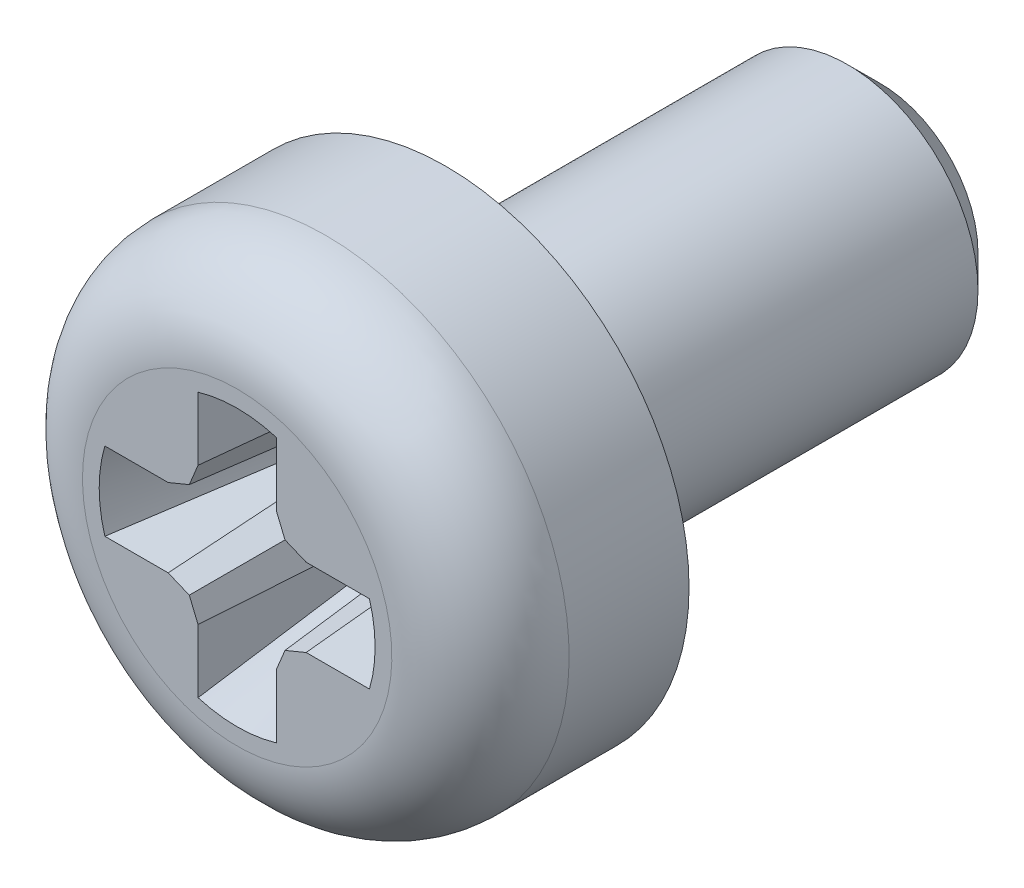
ISO-10303-21;
HEADER;
FILE_DESCRIPTION(('STEP AP214'),'2;1');
FILE_NAME('part.step','',(''),(''),'','','');
FILE_SCHEMA(('AUTOMOTIVE_DESIGN { 1 0 10303 214 1 1 1 1 }'));
ENDSEC;
DATA;
#1=APPLICATION_CONTEXT('core data for automotive mechanical design processes');
#2=APPLICATION_PROTOCOL_DEFINITION('international standard','automotive_design',2000,#1);
#3=PRODUCT_CONTEXT('',#1,'mechanical');
#4=PRODUCT('Part','Part','',(#3));
#5=PRODUCT_RELATED_PRODUCT_CATEGORY('part','',(#4));
#6=PRODUCT_DEFINITION_FORMATION('','',#4);
#7=PRODUCT_DEFINITION_CONTEXT('part definition',#1,'design');
#8=PRODUCT_DEFINITION('design','',#6,#7);
#9=PRODUCT_DEFINITION_SHAPE('','',#8);
#10=(LENGTH_UNIT() NAMED_UNIT(*) SI_UNIT(.MILLI.,.METRE.));
#11=(NAMED_UNIT(*) PLANE_ANGLE_UNIT() SI_UNIT($,.RADIAN.));
#12=(NAMED_UNIT(*) SI_UNIT($,.STERADIAN.) SOLID_ANGLE_UNIT());
#13=UNCERTAINTY_MEASURE_WITH_UNIT(LENGTH_MEASURE(1.E-05),#10,'distance_accuracy_value','');
#14=(GEOMETRIC_REPRESENTATION_CONTEXT(3) GLOBAL_UNCERTAINTY_ASSIGNED_CONTEXT((#13)) GLOBAL_UNIT_ASSIGNED_CONTEXT((#10,
#11,#12)) REPRESENTATION_CONTEXT('',''));
#15=CARTESIAN_POINT('',(0.,0.,0.));
#16=DIRECTION('',(0.,0.,1.));
#17=DIRECTION('',(1.,0.,0.));
#18=AXIS2_PLACEMENT_3D('',#15,#16,#17);
#19=CARTESIAN_POINT('',(0.,0.,0.));
#20=DIRECTION('',(0.,0.,1.));
#21=DIRECTION('',(1.,0.,0.));
#22=AXIS2_PLACEMENT_3D('',#19,#20,#21);
#23=PLANE('',#22);
#24=CARTESIAN_POINT('',(0.,0.,0.));
#25=DIRECTION('',(0.,0.,1.));
#26=DIRECTION('',(1.,0.,0.));
#27=AXIS2_PLACEMENT_3D('',#24,#25,#26);
#28=CIRCLE('',#27,2.8);
#29=CARTESIAN_POINT('',(2.8,0.,0.));
#30=VERTEX_POINT('',#29);
#31=EDGE_CURVE('E59',#30,#30,#28,.T.);
#32=ORIENTED_EDGE('',*,*,#31,.F.);
#33=EDGE_LOOP('',(#32));
#34=FACE_BOUND('',#33,.T.);
#35=CARTESIAN_POINT('',(0.,0.,0.));
#36=DIRECTION('',(0.,0.,1.));
#37=DIRECTION('',(1.,0.,0.));
#38=AXIS2_PLACEMENT_3D('',#35,#36,#37);
#39=CIRCLE('',#38,1.5);
#40=CARTESIAN_POINT('',(1.5,0.,0.));
#41=VERTEX_POINT('',#40);
#42=EDGE_CURVE('E11',#41,#41,#39,.F.);
#43=ORIENTED_EDGE('',*,*,#42,.F.);
#44=EDGE_LOOP('',(#43));
#45=FACE_BOUND('',#44,.T.);
#46=ADVANCED_FACE('F43',(#34,#45),#23,.F.);
#47=CARTESIAN_POINT('',(0.,0.,2.4));
#48=DIRECTION('',(0.,0.,-1.));
#49=DIRECTION('',(-1.,0.,0.));
#50=AXIS2_PLACEMENT_3D('',#47,#48,#49);
#51=CYLINDRICAL_SURFACE('',#50,2.8);
#52=CARTESIAN_POINT('',(0.,0.,1.38));
#53=DIRECTION('',(0.,0.,-1.));
#54=DIRECTION('',(0.,1.,0.));
#55=AXIS2_PLACEMENT_3D('',#52,#53,#54);
#56=CIRCLE('',#55,2.8);
#57=CARTESIAN_POINT('',(0.,2.8,1.38));
#58=VERTEX_POINT('',#57);
#59=EDGE_CURVE('E434',#58,#58,#56,.T.);
#60=ORIENTED_EDGE('',*,*,#59,.T.);
#61=EDGE_LOOP('',(#60));
#62=FACE_BOUND('',#61,.T.);
#63=ORIENTED_EDGE('',*,*,#31,.T.);
#64=EDGE_LOOP('',(#63));
#65=FACE_BOUND('',#64,.T.);
#66=ADVANCED_FACE('F369',(#62,#65),#51,.T.);
#67=CARTESIAN_POINT('',(0.,0.,1.38));
#68=DIRECTION('',(0.,0.,-1.));
#69=DIRECTION('',(0.,1.,0.));
#70=AXIS2_PLACEMENT_3D('',#67,#68,#69);
#71=TOROIDAL_SURFACE('',#70,1.78,1.02);
#72=ORIENTED_EDGE('',*,*,#59,.F.);
#73=EDGE_LOOP('',(#72));
#74=FACE_BOUND('',#73,.T.);
#75=CARTESIAN_POINT('',(0.,0.,2.4));
#76=DIRECTION('',(0.,0.,-1.));
#77=DIRECTION('',(0.,1.,0.));
#78=AXIS2_PLACEMENT_3D('',#75,#76,#77);
#79=CIRCLE('',#78,1.78);
#80=CARTESIAN_POINT('',(0.,1.78,2.4));
#81=VERTEX_POINT('',#80);
#82=EDGE_CURVE('E431',#81,#81,#79,.T.);
#83=ORIENTED_EDGE('',*,*,#82,.T.);
#84=EDGE_LOOP('',(#83));
#85=FACE_BOUND('',#84,.T.);
#86=ADVANCED_FACE('F377',(#74,#85),#71,.T.);
#87=CARTESIAN_POINT('',(0.,0.,2.4));
#88=DIRECTION('',(0.,0.,1.));
#89=DIRECTION('',(1.,0.,0.));
#90=AXIS2_PLACEMENT_3D('',#87,#88,#89);
#91=PLANE('',#90);
#92=DIRECTION('',(0.,-1.,0.));
#93=VECTOR('',#92,1.);
#94=CARTESIAN_POINT('',(-0.450000000000004,0.793749999999997,2.4));
#95=LINE('',#94,#93);
#96=CARTESIAN_POINT('',(-0.450000000000006,1.52238505313209,2.4));
#97=VERTEX_POINT('',#96);
#98=CARTESIAN_POINT('',(-0.450000000000004,0.793749999999997,2.4));
#99=VERTEX_POINT('',#98);
#100=EDGE_CURVE('E330',#97,#99,#95,.T.);
#101=ORIENTED_EDGE('',*,*,#100,.F.);
#102=CARTESIAN_POINT('',(0.,0.,2.4));
#103=DIRECTION('',(0.,0.,1.));
#104=DIRECTION('',(1.,0.,0.));
#105=AXIS2_PLACEMENT_3D('',#102,#103,#104);
#106=CIRCLE('',#105,1.5875);
#107=CARTESIAN_POINT('',(0.45,1.52238505313209,2.4));
#108=VERTEX_POINT('',#107);
#109=EDGE_CURVE('E335',#108,#97,#106,.T.);
#110=ORIENTED_EDGE('',*,*,#109,.F.);
#111=DIRECTION('',(0.,1.,0.));
#112=VECTOR('',#111,1.);
#113=CARTESIAN_POINT('',(0.45,1.52238505313209,2.4));
#114=LINE('',#113,#112);
#115=CARTESIAN_POINT('',(0.45,0.793749999999999,2.4));
#116=VERTEX_POINT('',#115);
#117=EDGE_CURVE('E423',#116,#108,#114,.T.);
#118=ORIENTED_EDGE('',*,*,#117,.F.);
#119=DIRECTION('',(-0.382683432365083,0.923879532511289,0.));
#120=VECTOR('',#119,1.);
#121=CARTESIAN_POINT('',(0.45,0.793749999999999,2.4));
#122=LINE('',#121,#120);
#123=CARTESIAN_POINT('',(0.550682043967123,0.550682043967123,2.4));
#124=VERTEX_POINT('',#123);
#125=EDGE_CURVE('E418',#124,#116,#122,.T.);
#126=ORIENTED_EDGE('',*,*,#125,.F.);
#127=DIRECTION('',(-0.92387953251129,0.382683432365083,0.));
#128=VECTOR('',#127,1.);
#129=CARTESIAN_POINT('',(0.793749999999998,0.450000000000001,2.4));
#130=LINE('',#129,#128);
#131=CARTESIAN_POINT('',(0.793749999999998,0.450000000000001,2.4));
#132=VERTEX_POINT('',#131);
#133=EDGE_CURVE('E196',#132,#124,#130,.T.);
#134=ORIENTED_EDGE('',*,*,#133,.F.);
#135=DIRECTION('',(-1.,0.,0.));
#136=VECTOR('',#135,1.);
#137=CARTESIAN_POINT('',(0.793749999999998,0.450000000000001,2.4));
#138=LINE('',#137,#136);
#139=CARTESIAN_POINT('',(1.52238505313209,0.450000000000001,2.4));
#140=VERTEX_POINT('',#139);
#141=EDGE_CURVE('E412',#140,#132,#138,.T.);
#142=ORIENTED_EDGE('',*,*,#141,.F.);
#143=CARTESIAN_POINT('',(0.,0.,2.4));
#144=DIRECTION('',(0.,0.,1.));
#145=DIRECTION('',(1.,0.,0.));
#146=AXIS2_PLACEMENT_3D('',#143,#144,#145);
#147=CIRCLE('',#146,1.5875);
#148=CARTESIAN_POINT('',(1.5223850531321,-0.449999999999984,2.4));
#149=VERTEX_POINT('',#148);
#150=EDGE_CURVE('E285',#149,#140,#147,.T.);
#151=ORIENTED_EDGE('',*,*,#150,.F.);
#152=DIRECTION('',(1.,0.,0.));
#153=VECTOR('',#152,1.);
#154=CARTESIAN_POINT('',(1.5223850531321,-0.449999999999984,2.4));
#155=LINE('',#154,#153);
#156=CARTESIAN_POINT('',(0.793750000000004,-0.449999999999992,2.4));
#157=VERTEX_POINT('',#156);
#158=EDGE_CURVE('E479',#157,#149,#155,.T.);
#159=ORIENTED_EDGE('',*,*,#158,.F.);
#160=DIRECTION('',(0.923879532511285,0.382683432365093,0.));
#161=VECTOR('',#160,1.);
#162=CARTESIAN_POINT('',(0.793750000000004,-0.449999999999992,2.4));
#163=LINE('',#162,#161);
#164=CARTESIAN_POINT('',(0.550682043967129,-0.550682043967117,2.4));
#165=VERTEX_POINT('',#164);
#166=EDGE_CURVE('E481',#165,#157,#163,.T.);
#167=ORIENTED_EDGE('',*,*,#166,.F.);
#168=DIRECTION('',(0.382683432365073,0.923879532511294,0.));
#169=VECTOR('',#168,1.);
#170=CARTESIAN_POINT('',(0.450000000000009,-0.793749999999994,2.4));
#171=LINE('',#170,#169);
#172=CARTESIAN_POINT('',(0.450000000000009,-0.793749999999994,2.4));
#173=VERTEX_POINT('',#172);
#174=EDGE_CURVE('E483',#173,#165,#171,.T.);
#175=ORIENTED_EDGE('',*,*,#174,.F.);
#176=DIRECTION('',(0.,1.,0.));
#177=VECTOR('',#176,1.);
#178=CARTESIAN_POINT('',(0.450000000000009,-0.793749999999994,2.4));
#179=LINE('',#178,#177);
#180=CARTESIAN_POINT('',(0.450000000000017,-1.52238505313209,2.4));
#181=VERTEX_POINT('',#180);
#182=EDGE_CURVE('E485',#181,#173,#179,.T.);
#183=ORIENTED_EDGE('',*,*,#182,.F.);
#184=CARTESIAN_POINT('',(0.,0.,2.4));
#185=DIRECTION('',(0.,0.,1.));
#186=DIRECTION('',(-1.,0.,0.));
#187=AXIS2_PLACEMENT_3D('',#184,#185,#186);
#188=CIRCLE('',#187,1.5875);
#189=CARTESIAN_POINT('',(-0.44999999999999,-1.52238505313209,2.4));
#190=VERTEX_POINT('',#189);
#191=EDGE_CURVE('E464',#190,#181,#188,.T.);
#192=ORIENTED_EDGE('',*,*,#191,.F.);
#193=DIRECTION('',(0.,-1.,0.));
#194=VECTOR('',#193,1.);
#195=CARTESIAN_POINT('',(-0.44999999999999,-1.52238505313209,2.4));
#196=LINE('',#195,#194);
#197=CARTESIAN_POINT('',(-0.449999999999995,-0.793750000000002,2.4));
#198=VERTEX_POINT('',#197);
#199=EDGE_CURVE('E467',#198,#190,#196,.T.);
#200=ORIENTED_EDGE('',*,*,#199,.F.);
#201=DIRECTION('',(0.38268343236509,-0.923879532511287,0.));
#202=VECTOR('',#201,1.);
#203=CARTESIAN_POINT('',(-0.449999999999995,-0.793750000000002,2.4));
#204=LINE('',#203,#202);
#205=CARTESIAN_POINT('',(-0.550682043967119,-0.550682043967127,2.4));
#206=VERTEX_POINT('',#205);
#207=EDGE_CURVE('E470',#206,#198,#204,.T.);
#208=ORIENTED_EDGE('',*,*,#207,.F.);
#209=DIRECTION('',(0.923879532511292,-0.382683432365077,0.));
#210=VECTOR('',#209,1.);
#211=CARTESIAN_POINT('',(-0.793749999999995,-0.450000000000007,2.4));
#212=LINE('',#211,#210);
#213=CARTESIAN_POINT('',(-0.793749999999995,-0.450000000000007,2.4));
#214=VERTEX_POINT('',#213);
#215=EDGE_CURVE('E473',#214,#206,#212,.T.);
#216=ORIENTED_EDGE('',*,*,#215,.F.);
#217=DIRECTION('',(1.,0.,0.));
#218=VECTOR('',#217,1.);
#219=CARTESIAN_POINT('',(-0.793749999999995,-0.450000000000007,2.4));
#220=LINE('',#219,#218);
#221=CARTESIAN_POINT('',(-1.52238505313209,-0.450000000000012,2.4));
#222=VERTEX_POINT('',#221);
#223=EDGE_CURVE('E476',#222,#214,#220,.T.);
#224=ORIENTED_EDGE('',*,*,#223,.F.);
#225=CARTESIAN_POINT('',(0.,0.,2.4));
#226=DIRECTION('',(0.,0.,1.));
#227=DIRECTION('',(0.,1.,0.));
#228=AXIS2_PLACEMENT_3D('',#225,#226,#227);
#229=CIRCLE('',#228,1.5875);
#230=CARTESIAN_POINT('',(-1.52238505313209,0.449999999999995,2.4));
#231=VERTEX_POINT('',#230);
#232=EDGE_CURVE('E141',#231,#222,#229,.T.);
#233=ORIENTED_EDGE('',*,*,#232,.F.);
#234=DIRECTION('',(-1.,0.,0.));
#235=VECTOR('',#234,1.);
#236=CARTESIAN_POINT('',(-1.52238505313209,0.449999999999995,2.4));
#237=LINE('',#236,#235);
#238=CARTESIAN_POINT('',(-0.79375,0.449999999999998,2.4));
#239=VERTEX_POINT('',#238);
#240=EDGE_CURVE('E453',#239,#231,#237,.T.);
#241=ORIENTED_EDGE('',*,*,#240,.F.);
#242=DIRECTION('',(-0.923879532511288,-0.382683432365087,0.));
#243=VECTOR('',#242,1.);
#244=CARTESIAN_POINT('',(-0.79375,0.449999999999998,2.4));
#245=LINE('',#244,#243);
#246=CARTESIAN_POINT('',(-0.550682043967125,0.550682043967121,2.4));
#247=VERTEX_POINT('',#246);
#248=EDGE_CURVE('E455',#247,#239,#245,.T.);
#249=ORIENTED_EDGE('',*,*,#248,.F.);
#250=DIRECTION('',(-0.38268343236508,-0.923879532511291,0.));
#251=VECTOR('',#250,1.);
#252=CARTESIAN_POINT('',(-0.450000000000004,0.793749999999997,2.4));
#253=LINE('',#252,#251);
#254=EDGE_CURVE('E460',#99,#247,#253,.T.);
#255=ORIENTED_EDGE('',*,*,#254,.F.);
#256=EDGE_LOOP('',(#101,#110,#118,#126,#134,#142,#151,#159,#167,#175,#183,#192,#200,#208,#216,
#224,#233,#241,#249,#255));
#257=FACE_BOUND('',#256,.T.);
#258=ORIENTED_EDGE('',*,*,#82,.F.);
#259=EDGE_LOOP('',(#258));
#260=FACE_BOUND('',#259,.T.);
#261=ADVANCED_FACE('F382',(#257,#260),#91,.T.);
#262=CARTESIAN_POINT('',(0.,0.,-5.));
#263=DIRECTION('',(0.,0.,1.));
#264=DIRECTION('',(1.,0.,0.));
#265=AXIS2_PLACEMENT_3D('',#262,#263,#264);
#266=PLANE('',#265);
#267=CARTESIAN_POINT('',(0.,0.,-5.));
#268=DIRECTION('',(0.,0.,1.));
#269=DIRECTION('',(1.,0.,0.));
#270=AXIS2_PLACEMENT_3D('',#267,#268,#269);
#271=CIRCLE('',#270,1.125);
#272=CARTESIAN_POINT('',(1.125,0.,-5.));
#273=VERTEX_POINT('',#272);
#274=EDGE_CURVE('E428',#273,#273,#271,.F.);
#275=ORIENTED_EDGE('',*,*,#274,.T.);
#276=EDGE_LOOP('',(#275));
#277=FACE_BOUND('',#276,.T.);
#278=ADVANCED_FACE('F385',(#277),#266,.F.);
#279=CARTESIAN_POINT('',(0.,0.,0.));
#280=DIRECTION('',(0.,0.,1.));
#281=DIRECTION('',(1.,0.,0.));
#282=AXIS2_PLACEMENT_3D('',#279,#280,#281);
#283=CYLINDRICAL_SURFACE('',#282,1.5);
#284=CARTESIAN_POINT('',(0.,0.,-4.625));
#285=DIRECTION('',(0.,0.,1.));
#286=DIRECTION('',(1.,0.,0.));
#287=AXIS2_PLACEMENT_3D('',#284,#285,#286);
#288=CIRCLE('',#287,1.5);
#289=CARTESIAN_POINT('',(1.5,0.,-4.625));
#290=VERTEX_POINT('',#289);
#291=EDGE_CURVE('E226',#290,#290,#288,.T.);
#292=ORIENTED_EDGE('',*,*,#291,.T.);
#293=EDGE_LOOP('',(#292));
#294=FACE_BOUND('',#293,.T.);
#295=ORIENTED_EDGE('',*,*,#42,.T.);
#296=EDGE_LOOP('',(#295));
#297=FACE_BOUND('',#296,.T.);
#298=ADVANCED_FACE('F391',(#294,#297),#283,.T.);
#299=CARTESIAN_POINT('',(0.,0.,-4.625));
#300=DIRECTION('',(0.,0.,1.));
#301=DIRECTION('',(1.,0.,0.));
#302=AXIS2_PLACEMENT_3D('',#299,#300,#301);
#303=CONICAL_SURFACE('',#302,1.5,0.785398163397451);
#304=ORIENTED_EDGE('',*,*,#274,.F.);
#305=EDGE_LOOP('',(#304));
#306=FACE_BOUND('',#305,.T.);
#307=ORIENTED_EDGE('',*,*,#291,.F.);
#308=EDGE_LOOP('',(#307));
#309=FACE_BOUND('',#308,.T.);
#310=ADVANCED_FACE('F235',(#306,#309),#303,.T.);
#311=CARTESIAN_POINT('',(0.,0.,2.4));
#312=DIRECTION('',(0.,0.,1.));
#313=DIRECTION('',(1.,0.,0.));
#314=AXIS2_PLACEMENT_3D('',#311,#312,#313);
#315=CONICAL_SURFACE('',#314,1.5875,0.26179938779915);
#316=ORIENTED_EDGE('',*,*,#109,.T.);
#317=CARTESIAN_POINT('',(-0.450000000000006,1.52238505313209,2.4));
#318=CARTESIAN_POINT('',(-0.414477744167481,1.41945884722323,1.99397875792218));
#319=CARTESIAN_POINT('',(-0.378956515806402,1.31648600397113,1.58796925989672));
#320=CARTESIAN_POINT('',(-0.30791611378637,1.11044704208215,0.775973749198562));
#321=CARTESIAN_POINT('',(-0.27239694012743,1.00738092344464,0.36998773652602));
#322=CARTESIAN_POINT('',(-0.23687879393995,0.904268167463262,-0.0359865320939932));
#323=B_SPLINE_CURVE_WITH_KNOTS('',3,(#317,#318,#319,#320,#321,#322),.UNSPECIFIED.,.F.,.F.,(4,2,
4),(0.,1.26110264823577,2.52220530501969),.UNSPECIFIED.);
#324=CARTESIAN_POINT('',(-0.271523126407119,1.00484524148506,0.36));
#325=VERTEX_POINT('',#324);
#326=EDGE_CURVE('E244',#325,#97,#323,.F.);
#327=ORIENTED_EDGE('',*,*,#326,.F.);
#328=CARTESIAN_POINT('',(0.,0.,0.36));
#329=DIRECTION('',(0.,0.,1.));
#330=DIRECTION('',(1.,0.,0.));
#331=AXIS2_PLACEMENT_3D('',#328,#329,#330);
#332=CIRCLE('',#331,1.04088364744051);
#333=CARTESIAN_POINT('',(0.271523126407115,1.00484524148506,0.36));
#334=VERTEX_POINT('',#333);
#335=EDGE_CURVE('E218',#334,#325,#332,.T.);
#336=ORIENTED_EDGE('',*,*,#335,.F.);
#337=CARTESIAN_POINT('',(0.271523126407115,1.00484524148506,0.36));
#338=CARTESIAN_POINT('',(0.318101305021576,1.13999510788411,0.892391017730642));
#339=CARTESIAN_POINT('',(0.364680851628295,1.27508285783648,1.42479767168435));
#340=CARTESIAN_POINT('',(0.424174405695201,1.44753878525971,2.10481210634625));
#341=CARTESIAN_POINT('',(0.43708715028611,1.48496430585635,2.25240545239254));
#342=CARTESIAN_POINT('',(0.45,1.52238505313209,2.4));
#343=B_SPLINE_CURVE_WITH_KNOTS('',3,(#337,#338,#339,#340,#341,#342),.UNSPECIFIED.,.F.,.F.,(4,2,
4),(0.,1.65374629121617,2.11217931713975),.UNSPECIFIED.);
#344=EDGE_CURVE('E68',#334,#108,#343,.T.);
#345=ORIENTED_EDGE('',*,*,#344,.T.);
#346=EDGE_LOOP('',(#316,#327,#336,#345));
#347=FACE_BOUND('',#346,.T.);
#348=ADVANCED_FACE('F232',(#347),#315,.F.);
#349=CARTESIAN_POINT('',(0.45,1.52238505313209,2.4));
#350=DIRECTION('',(-0.996194698091746,0.,0.0871557427476584));
#351=DIRECTION('',(0.0871557427476584,0.,0.996194698091746));
#352=AXIS2_PLACEMENT_3D('',#349,#350,#351);
#353=PLANE('',#352);
#354=ORIENTED_EDGE('',*,*,#117,.T.);
#355=ORIENTED_EDGE('',*,*,#344,.F.);
#356=DIRECTION('',(0.,-1.,0.));
#357=VECTOR('',#356,1.);
#358=CARTESIAN_POINT('',(0.271523126407115,0.,0.36));
#359=LINE('',#358,#357);
#360=CARTESIAN_POINT('',(0.271523126407115,0.758248742551119,0.36));
#361=VERTEX_POINT('',#360);
#362=EDGE_CURVE('E208',#361,#334,#359,.F.);
#363=ORIENTED_EDGE('',*,*,#362,.F.);
#364=DIRECTION('',(0.0871426484044397,0.01733375049386,0.996045029063886));
#365=VECTOR('',#364,1.);
#366=CARTESIAN_POINT('',(0.451100609750691,0.79396892489107,2.41258002701532));
#367=LINE('',#366,#365);
#368=EDGE_CURVE('E200',#361,#116,#367,.T.);
#369=ORIENTED_EDGE('',*,*,#368,.T.);
#370=EDGE_LOOP('',(#354,#355,#363,#369));
#371=FACE_BOUND('',#370,.T.);
#372=ADVANCED_FACE('F228',(#371),#353,.T.);
#373=CARTESIAN_POINT('',(0.45,0.793749999999999,2.4));
#374=DIRECTION('',(-0.920363891963227,-0.381227206369647,0.0871557427476584));
#375=DIRECTION('',(0.382683432365083,-0.92387953251129,0.));
#376=AXIS2_PLACEMENT_3D('',#373,#374,#375);
#377=PLANE('',#376);
#378=ORIENTED_EDGE('',*,*,#125,.T.);
#379=ORIENTED_EDGE('',*,*,#368,.F.);
#380=DIRECTION('',(0.382683432365083,-0.92387953251129,0.));
#381=VECTOR('',#380,1.);
#382=CARTESIAN_POINT('',(0.499840899011311,0.207040879399241,0.36));
#383=LINE('',#382,#381);
#384=CARTESIAN_POINT('',(0.414081758798491,0.414081758798492,0.36));
#385=VERTEX_POINT('',#384);
#386=EDGE_CURVE('E204',#385,#361,#383,.F.);
#387=ORIENTED_EDGE('',*,*,#386,.F.);
#388=DIRECTION('',(0.0666626913468326,0.0666626913468326,0.995546167269401));
#389=VECTOR('',#388,1.);
#390=CARTESIAN_POINT('',(0.551314794774615,0.551314794774616,2.40944955309347));
#391=LINE('',#390,#389);
#392=EDGE_CURVE('E189',#385,#124,#391,.T.);
#393=ORIENTED_EDGE('',*,*,#392,.T.);
#394=EDGE_LOOP('',(#378,#379,#387,#393));
#395=FACE_BOUND('',#394,.T.);
#396=ADVANCED_FACE('F205',(#395),#377,.T.);
#397=CARTESIAN_POINT('',(0.793749999999998,0.450000000000001,2.4));
#398=DIRECTION('',(-0.381227206369647,-0.920363891963227,0.0871557427476584));
#399=DIRECTION('',(0.92387953251129,-0.382683432365083,0.));
#400=AXIS2_PLACEMENT_3D('',#397,#398,#399);
#401=PLANE('',#400);
#402=ORIENTED_EDGE('',*,*,#133,.T.);
#403=ORIENTED_EDGE('',*,*,#392,.F.);
#404=DIRECTION('',(0.92387953251129,-0.382683432365083,0.));
#405=VECTOR('',#404,1.);
#406=CARTESIAN_POINT('',(0.207040879399241,0.499840899011311,0.36));
#407=LINE('',#406,#405);
#408=CARTESIAN_POINT('',(0.758248742551118,0.271523126407116,0.36));
#409=VERTEX_POINT('',#408);
#410=EDGE_CURVE('E193',#409,#385,#407,.F.);
#411=ORIENTED_EDGE('',*,*,#410,.F.);
#412=DIRECTION('',(0.0173337504938599,0.0871426484044397,0.996045029063886));
#413=VECTOR('',#412,1.);
#414=CARTESIAN_POINT('',(0.793749999999998,0.450000000000001,2.4));
#415=LINE('',#414,#413);
#416=EDGE_CURVE('E201',#409,#132,#415,.T.);
#417=ORIENTED_EDGE('',*,*,#416,.T.);
#418=EDGE_LOOP('',(#402,#403,#411,#417));
#419=FACE_BOUND('',#418,.T.);
#420=ADVANCED_FACE('F191',(#419),#401,.T.);
#421=CARTESIAN_POINT('',(0.793749999999998,0.450000000000001,2.4));
#422=DIRECTION('',(0.,-0.996194698091745,0.0871557427476584));
#423=DIRECTION('',(0.,-0.0871557427476584,-0.996194698091746));
#424=AXIS2_PLACEMENT_3D('',#421,#422,#423);
#425=PLANE('',#424);
#426=ORIENTED_EDGE('',*,*,#141,.T.);
#427=ORIENTED_EDGE('',*,*,#416,.F.);
#428=DIRECTION('',(1.,0.,0.));
#429=VECTOR('',#428,1.);
#430=CARTESIAN_POINT('',(0.,0.271523126407116,0.36));
#431=LINE('',#430,#429);
#432=CARTESIAN_POINT('',(1.00484524148506,0.271523126407116,0.36));
#433=VERTEX_POINT('',#432);
#434=EDGE_CURVE('E212',#433,#409,#431,.F.);
#435=ORIENTED_EDGE('',*,*,#434,.F.);
#436=CARTESIAN_POINT('',(1.52238505313209,0.450000000000001,2.4));
#437=CARTESIAN_POINT('',(1.41945884722323,0.414477744167476,1.99397875792218));
#438=CARTESIAN_POINT('',(1.31648600397113,0.378956515806398,1.58796925989672));
#439=CARTESIAN_POINT('',(1.11044704208215,0.307916113786366,0.775973749198562));
#440=CARTESIAN_POINT('',(1.00738092344464,0.272396940127426,0.36998773652602));
#441=CARTESIAN_POINT('',(0.904268167463263,0.236878793939947,-0.0359865320939933));
#442=B_SPLINE_CURVE_WITH_KNOTS('',3,(#436,#437,#438,#439,#440,#441),.UNSPECIFIED.,.F.,.F.,(4,2,
4),(0.,1.26110264823577,2.52220530501969),.UNSPECIFIED.);
#443=EDGE_CURVE('E409',#433,#140,#442,.F.);
#444=ORIENTED_EDGE('',*,*,#443,.T.);
#445=EDGE_LOOP('',(#426,#427,#435,#444));
#446=FACE_BOUND('',#445,.T.);
#447=ADVANCED_FACE('F240',(#446),#425,.T.);
#448=CARTESIAN_POINT('',(0.,0.,2.4));
#449=DIRECTION('',(0.,0.,1.));
#450=DIRECTION('',(1.,0.,0.));
#451=AXIS2_PLACEMENT_3D('',#448,#449,#450);
#452=CONICAL_SURFACE('',#451,1.5875,0.26179938779915);
#453=ORIENTED_EDGE('',*,*,#150,.T.);
#454=ORIENTED_EDGE('',*,*,#443,.F.);
#455=CARTESIAN_POINT('',(0.,0.,0.36));
#456=DIRECTION('',(0.,0.,1.));
#457=DIRECTION('',(1.,0.,0.));
#458=AXIS2_PLACEMENT_3D('',#455,#456,#457);
#459=CIRCLE('',#458,1.04088364744051);
#460=CARTESIAN_POINT('',(1.00484524148506,-0.271523126407104,0.36));
#461=VERTEX_POINT('',#460);
#462=EDGE_CURVE('E132',#461,#433,#459,.T.);
#463=ORIENTED_EDGE('',*,*,#462,.F.);
#464=CARTESIAN_POINT('',(1.00484524148506,-0.271523126407104,0.36));
#465=CARTESIAN_POINT('',(1.13999510788411,-0.318101305021564,0.892391017730642));
#466=CARTESIAN_POINT('',(1.27508285783649,-0.364680851628282,1.42479767168435));
#467=CARTESIAN_POINT('',(1.44753878525972,-0.424174405695186,2.10481210634625));
#468=CARTESIAN_POINT('',(1.48496430585636,-0.437087150286095,2.25240545239254));
#469=CARTESIAN_POINT('',(1.5223850531321,-0.449999999999984,2.4));
#470=B_SPLINE_CURVE_WITH_KNOTS('',3,(#464,#465,#466,#467,#468,#469),.UNSPECIFIED.,.F.,.F.,(4,2,
4),(0.,1.65374629121617,2.11217931713975),.UNSPECIFIED.);
#471=EDGE_CURVE('E47',#461,#149,#470,.T.);
#472=ORIENTED_EDGE('',*,*,#471,.T.);
#473=EDGE_LOOP('',(#453,#454,#463,#472));
#474=FACE_BOUND('',#473,.T.);
#475=ADVANCED_FACE('F237',(#474),#452,.F.);
#476=CARTESIAN_POINT('',(0.,0.,0.36));
#477=DIRECTION('',(0.,0.,1.));
#478=DIRECTION('',(1.,0.,0.));
#479=AXIS2_PLACEMENT_3D('',#476,#477,#478);
#480=PLANE('',#479);
#481=ORIENTED_EDGE('',*,*,#335,.T.);
#482=DIRECTION('',(0.,1.,0.));
#483=VECTOR('',#482,1.);
#484=CARTESIAN_POINT('',(-0.271523126407116,0.,0.36));
#485=LINE('',#484,#483);
#486=CARTESIAN_POINT('',(-0.271523126407118,0.758248742551118,0.36));
#487=VERTEX_POINT('',#486);
#488=EDGE_CURVE('E257',#325,#487,#485,.F.);
#489=ORIENTED_EDGE('',*,*,#488,.T.);
#490=DIRECTION('',(0.38268343236508,0.923879532511291,0.));
#491=VECTOR('',#490,1.);
#492=CARTESIAN_POINT('',(-0.499840899011312,0.20704087939924,0.36));
#493=LINE('',#492,#491);
#494=CARTESIAN_POINT('',(-0.414081758798493,0.41408175879849,0.36));
#495=VERTEX_POINT('',#494);
#496=EDGE_CURVE('E451',#487,#495,#493,.F.);
#497=ORIENTED_EDGE('',*,*,#496,.T.);
#498=DIRECTION('',(0.923879532511288,0.382683432365087,0.));
#499=VECTOR('',#498,1.);
#500=CARTESIAN_POINT('',(-0.207040879399243,0.49984089901131,0.36));
#501=LINE('',#500,#499);
#502=CARTESIAN_POINT('',(-0.75824874255112,0.271523126407112,0.36));
#503=VERTEX_POINT('',#502);
#504=EDGE_CURVE('E452',#495,#503,#501,.F.);
#505=ORIENTED_EDGE('',*,*,#504,.T.);
#506=DIRECTION('',(1.,0.,0.));
#507=VECTOR('',#506,1.);
#508=CARTESIAN_POINT('',(0.,0.271523126407115,0.36));
#509=LINE('',#508,#507);
#510=CARTESIAN_POINT('',(-1.00484524148506,0.271523126407112,0.36));
#511=VERTEX_POINT('',#510);
#512=EDGE_CURVE('E286',#503,#511,#509,.F.);
#513=ORIENTED_EDGE('',*,*,#512,.T.);
#514=CARTESIAN_POINT('',(0.,0.,0.36));
#515=DIRECTION('',(0.,0.,1.));
#516=DIRECTION('',(1.,0.,0.));
#517=AXIS2_PLACEMENT_3D('',#514,#515,#516);
#518=CIRCLE('',#517,1.04088364744051);
#519=CARTESIAN_POINT('',(-1.00484524148505,-0.271523126407123,0.36));
#520=VERTEX_POINT('',#519);
#521=EDGE_CURVE('E254',#511,#520,#518,.T.);
#522=ORIENTED_EDGE('',*,*,#521,.T.);
#523=DIRECTION('',(-1.,0.,0.));
#524=VECTOR('',#523,1.);
#525=CARTESIAN_POINT('',(0.,-0.271523126407116,0.36));
#526=LINE('',#525,#524);
#527=CARTESIAN_POINT('',(-0.758248742551117,-0.271523126407121,0.36));
#528=VERTEX_POINT('',#527);
#529=EDGE_CURVE('E306',#520,#528,#526,.F.);
#530=ORIENTED_EDGE('',*,*,#529,.T.);
#531=DIRECTION('',(-0.923879532511292,0.382683432365077,0.));
#532=VECTOR('',#531,1.);
#533=CARTESIAN_POINT('',(-0.207040879399238,-0.499840899011313,0.36));
#534=LINE('',#533,#532);
#535=CARTESIAN_POINT('',(-0.414081758798488,-0.414081758798494,0.36));
#536=VERTEX_POINT('',#535);
#537=EDGE_CURVE('E700',#528,#536,#534,.F.);
#538=ORIENTED_EDGE('',*,*,#537,.T.);
#539=DIRECTION('',(-0.38268343236509,0.923879532511287,0.));
#540=VECTOR('',#539,1.);
#541=CARTESIAN_POINT('',(-0.49984089901131,-0.207040879399245,0.36));
#542=LINE('',#541,#540);
#543=CARTESIAN_POINT('',(-0.27152312640711,-0.758248742551121,0.36));
#544=VERTEX_POINT('',#543);
#545=EDGE_CURVE('E512',#536,#544,#542,.F.);
#546=ORIENTED_EDGE('',*,*,#545,.T.);
#547=DIRECTION('',(0.,1.,0.));
#548=VECTOR('',#547,1.);
#549=CARTESIAN_POINT('',(-0.271523126407115,0.,0.36));
#550=LINE('',#549,#548);
#551=CARTESIAN_POINT('',(-0.271523126407108,-1.00484524148506,0.36));
#552=VERTEX_POINT('',#551);
#553=EDGE_CURVE('E331',#544,#552,#550,.F.);
#554=ORIENTED_EDGE('',*,*,#553,.T.);
#555=CARTESIAN_POINT('',(0.,0.,0.36));
#556=DIRECTION('',(0.,0.,1.));
#557=DIRECTION('',(1.,0.,0.));
#558=AXIS2_PLACEMENT_3D('',#555,#556,#557);
#559=CIRCLE('',#558,1.04088364744051);
#560=CARTESIAN_POINT('',(0.271523126407126,-1.00484524148505,0.36));
#561=VERTEX_POINT('',#560);
#562=EDGE_CURVE('E303',#552,#561,#559,.T.);
#563=ORIENTED_EDGE('',*,*,#562,.T.);
#564=DIRECTION('',(0.,-1.,0.));
#565=VECTOR('',#564,1.);
#566=CARTESIAN_POINT('',(0.271523126407116,0.,0.36));
#567=LINE('',#566,#565);
#568=CARTESIAN_POINT('',(0.271523126407123,-0.758248742551116,0.36));
#569=VERTEX_POINT('',#568);
#570=EDGE_CURVE('E352',#561,#569,#567,.F.);
#571=ORIENTED_EDGE('',*,*,#570,.T.);
#572=DIRECTION('',(-0.382683432365073,-0.923879532511294,0.));
#573=VECTOR('',#572,1.);
#574=CARTESIAN_POINT('',(0.499840899011313,-0.207040879399236,0.36));
#575=LINE('',#574,#573);
#576=CARTESIAN_POINT('',(0.414081758798496,-0.414081758798487,0.36));
#577=VERTEX_POINT('',#576);
#578=EDGE_CURVE('E704',#569,#577,#575,.F.);
#579=ORIENTED_EDGE('',*,*,#578,.T.);
#580=DIRECTION('',(-0.923879532511286,-0.382683432365093,0.));
#581=VECTOR('',#580,1.);
#582=CARTESIAN_POINT('',(0.207040879399247,-0.499840899011309,0.36));
#583=LINE('',#582,#581);
#584=CARTESIAN_POINT('',(0.758248742551122,-0.271523126407107,0.36));
#585=VERTEX_POINT('',#584);
#586=EDGE_CURVE('E705',#577,#585,#583,.F.);
#587=ORIENTED_EDGE('',*,*,#586,.T.);
#588=DIRECTION('',(-1.,0.,0.));
#589=VECTOR('',#588,1.);
#590=CARTESIAN_POINT('',(0.,-0.271523126407115,0.36));
#591=LINE('',#590,#589);
#592=EDGE_CURVE('E351',#585,#461,#591,.F.);
#593=ORIENTED_EDGE('',*,*,#592,.T.);
#594=ORIENTED_EDGE('',*,*,#462,.T.);
#595=ORIENTED_EDGE('',*,*,#434,.T.);
#596=ORIENTED_EDGE('',*,*,#410,.T.);
#597=ORIENTED_EDGE('',*,*,#386,.T.);
#598=ORIENTED_EDGE('',*,*,#362,.T.);
#599=EDGE_LOOP('',(#481,#489,#497,#505,#513,#522,#530,#538,#546,#554,#563,#571,#579,#587,#593,
#594,#595,#596,#597,#598));
#600=FACE_BOUND('',#599,.T.);
#601=ADVANCED_FACE('F210',(#600),#480,.T.);
#602=CARTESIAN_POINT('',(0.,0.,2.4));
#603=DIRECTION('',(0.,0.,1.));
#604=DIRECTION('',(0.,1.,0.));
#605=AXIS2_PLACEMENT_3D('',#602,#603,#604);
#606=CONICAL_SURFACE('',#605,1.5875,0.26179938779915);
#607=ORIENTED_EDGE('',*,*,#232,.T.);
#608=CARTESIAN_POINT('',(-1.52238505313209,-0.450000000000012,2.4));
#609=CARTESIAN_POINT('',(-1.41945884722323,-0.414477744167486,1.99397875792218));
#610=CARTESIAN_POINT('',(-1.31648600397113,-0.378956515806407,1.58796925989672));
#611=CARTESIAN_POINT('',(-1.11044704208215,-0.307916113786373,0.775973749198562));
#612=CARTESIAN_POINT('',(-1.00738092344464,-0.272396940127433,0.36998773652602));
#613=CARTESIAN_POINT('',(-0.904268167463262,-0.236878793939953,-0.0359865320939933));
#614=B_SPLINE_CURVE_WITH_KNOTS('',3,(#608,#609,#610,#611,#612,#613),.UNSPECIFIED.,.F.,.F.,(4,2,
4),(0.,1.26110264823577,2.52220530501969),.UNSPECIFIED.);
#615=EDGE_CURVE('E294',#520,#222,#614,.F.);
#616=ORIENTED_EDGE('',*,*,#615,.F.);
#617=ORIENTED_EDGE('',*,*,#521,.F.);
#618=CARTESIAN_POINT('',(-1.00484524148506,0.271523126407112,0.36));
#619=CARTESIAN_POINT('',(-1.13999510788411,0.318101305021572,0.892391017730642));
#620=CARTESIAN_POINT('',(-1.27508285783648,0.364680851628291,1.42479767168435));
#621=CARTESIAN_POINT('',(-1.44753878525971,0.424174405695196,2.10481210634625));
#622=CARTESIAN_POINT('',(-1.48496430585635,0.437087150286105,2.25240545239254));
#623=CARTESIAN_POINT('',(-1.52238505313209,0.449999999999995,2.4));
#624=B_SPLINE_CURVE_WITH_KNOTS('',3,(#618,#619,#620,#621,#622,#623),.UNSPECIFIED.,.F.,.F.,(4,2,
4),(0.,1.65374629121617,2.11217931713975),.UNSPECIFIED.);
#625=EDGE_CURVE('E278',#511,#231,#624,.T.);
#626=ORIENTED_EDGE('',*,*,#625,.T.);
#627=EDGE_LOOP('',(#607,#616,#617,#626));
#628=FACE_BOUND('',#627,.T.);
#629=ADVANCED_FACE('F274',(#628),#606,.F.);
#630=CARTESIAN_POINT('',(-1.52238505313209,0.449999999999995,2.4));
#631=DIRECTION('',(0.,-0.996194698091746,0.0871557427476584));
#632=DIRECTION('',(0.,-0.0871557427476584,-0.996194698091746));
#633=AXIS2_PLACEMENT_3D('',#630,#631,#632);
#634=PLANE('',#633);
#635=ORIENTED_EDGE('',*,*,#240,.T.);
#636=ORIENTED_EDGE('',*,*,#625,.F.);
#637=ORIENTED_EDGE('',*,*,#512,.F.);
#638=DIRECTION('',(-0.0173337504938603,0.0871426484044396,0.996045029063886));
#639=VECTOR('',#638,1.);
#640=CARTESIAN_POINT('',(-0.793968924891071,0.451100609750688,2.41258002701532));
#641=LINE('',#640,#639);
#642=EDGE_CURVE('E255',#503,#239,#641,.T.);
#643=ORIENTED_EDGE('',*,*,#642,.T.);
#644=EDGE_LOOP('',(#635,#636,#637,#643));
#645=FACE_BOUND('',#644,.T.);
#646=ADVANCED_FACE('F269',(#645),#634,.T.);
#647=CARTESIAN_POINT('',(-0.79375,0.449999999999998,2.4));
#648=DIRECTION('',(0.38122720636965,-0.920363891963226,0.0871557427476584));
#649=DIRECTION('',(0.923879532511288,0.382683432365087,0.));
#650=AXIS2_PLACEMENT_3D('',#647,#648,#649);
#651=PLANE('',#650);
#652=ORIENTED_EDGE('',*,*,#248,.T.);
#653=ORIENTED_EDGE('',*,*,#642,.F.);
#654=ORIENTED_EDGE('',*,*,#504,.F.);
#655=DIRECTION('',(-0.0666626913468328,0.0666626913468323,0.995546167269401));
#656=VECTOR('',#655,1.);
#657=CARTESIAN_POINT('',(-0.551314794774618,0.551314794774613,2.40944955309347));
#658=LINE('',#657,#656);
#659=EDGE_CURVE('E528',#495,#247,#658,.T.);
#660=ORIENTED_EDGE('',*,*,#659,.T.);
#661=EDGE_LOOP('',(#652,#653,#654,#660));
#662=FACE_BOUND('',#661,.T.);
#663=ADVANCED_FACE('F273',(#662),#651,.T.);
#664=CARTESIAN_POINT('',(-0.450000000000004,0.793749999999997,2.4));
#665=DIRECTION('',(0.920363891963228,-0.381227206369644,0.0871557427476584));
#666=DIRECTION('',(0.38268343236508,0.923879532511291,0.));
#667=AXIS2_PLACEMENT_3D('',#664,#665,#666);
#668=PLANE('',#667);
#669=ORIENTED_EDGE('',*,*,#254,.T.);
#670=ORIENTED_EDGE('',*,*,#659,.F.);
#671=ORIENTED_EDGE('',*,*,#496,.F.);
#672=DIRECTION('',(-0.0871426484044397,0.0173337504938596,0.996045029063886));
#673=VECTOR('',#672,1.);
#674=CARTESIAN_POINT('',(-0.450000000000004,0.793749999999997,2.4));
#675=LINE('',#674,#673);
#676=EDGE_CURVE('E253',#487,#99,#675,.T.);
#677=ORIENTED_EDGE('',*,*,#676,.T.);
#678=EDGE_LOOP('',(#669,#670,#671,#677));
#679=FACE_BOUND('',#678,.T.);
#680=ADVANCED_FACE('F265',(#679),#668,.T.);
#681=CARTESIAN_POINT('',(-0.450000000000004,0.793749999999997,2.4));
#682=DIRECTION('',(0.996194698091745,0.,0.0871557427476584));
#683=DIRECTION('',(0.0871557427476584,0.,-0.996194698091746));
#684=AXIS2_PLACEMENT_3D('',#681,#682,#683);
#685=PLANE('',#684);
#686=ORIENTED_EDGE('',*,*,#100,.T.);
#687=ORIENTED_EDGE('',*,*,#676,.F.);
#688=ORIENTED_EDGE('',*,*,#488,.F.);
#689=ORIENTED_EDGE('',*,*,#326,.T.);
#690=EDGE_LOOP('',(#686,#687,#688,#689));
#691=FACE_BOUND('',#690,.T.);
#692=ADVANCED_FACE('F259',(#691),#685,.T.);
#693=CARTESIAN_POINT('',(0.,0.,2.4));
#694=DIRECTION('',(0.,0.,1.));
#695=DIRECTION('',(-1.,0.,0.));
#696=AXIS2_PLACEMENT_3D('',#693,#694,#695);
#697=CONICAL_SURFACE('',#696,1.5875,0.26179938779915);
#698=ORIENTED_EDGE('',*,*,#191,.T.);
#699=CARTESIAN_POINT('',(0.450000000000017,-1.52238505313209,2.4));
#700=CARTESIAN_POINT('',(0.414477744167491,-1.41945884722322,1.99397875792218));
#701=CARTESIAN_POINT('',(0.378956515806412,-1.31648600397112,1.58796925989672));
#702=CARTESIAN_POINT('',(0.307916113786377,-1.11044704208215,0.775973749198562));
#703=CARTESIAN_POINT('',(0.272396940127437,-1.00738092344464,0.36998773652602));
#704=CARTESIAN_POINT('',(0.236878793939956,-0.904268167463261,-0.0359865320939933));
#705=B_SPLINE_CURVE_WITH_KNOTS('',3,(#699,#700,#701,#702,#703,#704),.UNSPECIFIED.,.F.,.F.,(4,2,
4),(0.,1.26110264823577,2.52220530501969),.UNSPECIFIED.);
#706=EDGE_CURVE('E340',#561,#181,#705,.F.);
#707=ORIENTED_EDGE('',*,*,#706,.F.);
#708=ORIENTED_EDGE('',*,*,#562,.F.);
#709=CARTESIAN_POINT('',(-0.271523126407108,-1.00484524148506,0.36));
#710=CARTESIAN_POINT('',(-0.318101305021568,-1.13999510788411,0.892391017730642));
#711=CARTESIAN_POINT('',(-0.364680851628286,-1.27508285783649,1.42479767168435));
#712=CARTESIAN_POINT('',(-0.424174405695191,-1.44753878525971,2.10481210634625));
#713=CARTESIAN_POINT('',(-0.4370871502861,-1.48496430585635,2.25240545239254));
#714=CARTESIAN_POINT('',(-0.44999999999999,-1.52238505313209,2.4));
#715=B_SPLINE_CURVE_WITH_KNOTS('',3,(#709,#710,#711,#712,#713,#714),.UNSPECIFIED.,.F.,.F.,(4,2,
4),(0.,1.65374629121617,2.11217931713975),.UNSPECIFIED.);
#716=EDGE_CURVE('E323',#552,#190,#715,.T.);
#717=ORIENTED_EDGE('',*,*,#716,.T.);
#718=EDGE_LOOP('',(#698,#707,#708,#717));
#719=FACE_BOUND('',#718,.T.);
#720=ADVANCED_FACE('F264',(#719),#697,.F.);
#721=CARTESIAN_POINT('',(-0.44999999999999,-1.52238505313209,2.4));
#722=DIRECTION('',(0.996194698091746,0.,0.0871557427476584));
#723=DIRECTION('',(0.0871557427476584,0.,-0.996194698091746));
#724=AXIS2_PLACEMENT_3D('',#721,#722,#723);
#725=PLANE('',#724);
#726=ORIENTED_EDGE('',*,*,#199,.T.);
#727=ORIENTED_EDGE('',*,*,#716,.F.);
#728=ORIENTED_EDGE('',*,*,#553,.F.);
#729=DIRECTION('',(-0.0871426484044396,-0.0173337504938606,0.996045029063886));
#730=VECTOR('',#729,1.);
#731=CARTESIAN_POINT('',(-0.451100609750685,-0.793968924891073,2.41258002701532));
#732=LINE('',#731,#730);
#733=EDGE_CURVE('E304',#544,#198,#732,.T.);
#734=ORIENTED_EDGE('',*,*,#733,.T.);
#735=EDGE_LOOP('',(#726,#727,#728,#734));
#736=FACE_BOUND('',#735,.T.);
#737=ADVANCED_FACE('F315',(#736),#725,.T.);
#738=CARTESIAN_POINT('',(-0.449999999999995,-0.793750000000002,2.4));
#739=DIRECTION('',(0.920363891963224,0.381227206369653,0.0871557427476584));
#740=DIRECTION('',(-0.38268343236509,0.923879532511287,0.));
#741=AXIS2_PLACEMENT_3D('',#738,#739,#740);
#742=PLANE('',#741);
#743=ORIENTED_EDGE('',*,*,#207,.T.);
#744=ORIENTED_EDGE('',*,*,#733,.F.);
#745=ORIENTED_EDGE('',*,*,#545,.F.);
#746=DIRECTION('',(-0.0666626913468321,-0.066662691346833,0.995546167269401));
#747=VECTOR('',#746,1.);
#748=CARTESIAN_POINT('',(-0.551314794774611,-0.55131479477462,2.40944955309347));
#749=LINE('',#748,#747);
#750=EDGE_CURVE('E511',#536,#206,#749,.T.);
#751=ORIENTED_EDGE('',*,*,#750,.T.);
#752=EDGE_LOOP('',(#743,#744,#745,#751));
#753=FACE_BOUND('',#752,.T.);
#754=ADVANCED_FACE('F319',(#753),#742,.T.);
#755=CARTESIAN_POINT('',(-0.793749999999995,-0.450000000000007,2.4));
#756=DIRECTION('',(0.38122720636964,0.92036389196323,0.0871557427476584));
#757=DIRECTION('',(-0.923879532511292,0.382683432365077,0.));
#758=AXIS2_PLACEMENT_3D('',#755,#756,#757);
#759=PLANE('',#758);
#760=ORIENTED_EDGE('',*,*,#215,.T.);
#761=ORIENTED_EDGE('',*,*,#750,.F.);
#762=ORIENTED_EDGE('',*,*,#537,.F.);
#763=DIRECTION('',(-0.0173337504938593,-0.0871426484044398,0.996045029063886));
#764=VECTOR('',#763,1.);
#765=CARTESIAN_POINT('',(-0.793749999999995,-0.450000000000007,2.4));
#766=LINE('',#765,#764);
#767=EDGE_CURVE('E302',#528,#214,#766,.T.);
#768=ORIENTED_EDGE('',*,*,#767,.T.);
#769=EDGE_LOOP('',(#760,#761,#762,#768));
#770=FACE_BOUND('',#769,.T.);
#771=ADVANCED_FACE('F313',(#770),#759,.T.);
#772=CARTESIAN_POINT('',(-0.793749999999995,-0.450000000000007,2.4));
#773=DIRECTION('',(0.,0.996194698091745,0.0871557427476584));
#774=DIRECTION('',(0.,-0.0871557427476584,0.996194698091746));
#775=AXIS2_PLACEMENT_3D('',#772,#773,#774);
#776=PLANE('',#775);
#777=ORIENTED_EDGE('',*,*,#223,.T.);
#778=ORIENTED_EDGE('',*,*,#767,.F.);
#779=ORIENTED_EDGE('',*,*,#529,.F.);
#780=ORIENTED_EDGE('',*,*,#615,.T.);
#781=EDGE_LOOP('',(#777,#778,#779,#780));
#782=FACE_BOUND('',#781,.T.);
#783=ADVANCED_FACE('F308',(#782),#776,.T.);
#784=CARTESIAN_POINT('',(1.5223850531321,-0.449999999999984,2.4));
#785=DIRECTION('',(0.,0.996194698091746,0.0871557427476584));
#786=DIRECTION('',(0.,-0.0871557427476584,0.996194698091746));
#787=AXIS2_PLACEMENT_3D('',#784,#785,#786);
#788=PLANE('',#787);
#789=ORIENTED_EDGE('',*,*,#158,.T.);
#790=ORIENTED_EDGE('',*,*,#471,.F.);
#791=ORIENTED_EDGE('',*,*,#592,.F.);
#792=DIRECTION('',(0.0173337504938609,-0.0871426484044395,0.996045029063886));
#793=VECTOR('',#792,1.);
#794=CARTESIAN_POINT('',(0.793968924891075,-0.451100609750682,2.41258002701532));
#795=LINE('',#794,#793);
#796=EDGE_CURVE('E124',#585,#157,#795,.T.);
#797=ORIENTED_EDGE('',*,*,#796,.T.);
#798=EDGE_LOOP('',(#789,#790,#791,#797));
#799=FACE_BOUND('',#798,.T.);
#800=ADVANCED_FACE('F312',(#799),#788,.T.);
#801=CARTESIAN_POINT('',(0.793750000000004,-0.449999999999992,2.4));
#802=DIRECTION('',(-0.381227206369657,0.920363891963223,0.0871557427476584));
#803=DIRECTION('',(-0.923879532511286,-0.382683432365093,0.));
#804=AXIS2_PLACEMENT_3D('',#801,#802,#803);
#805=PLANE('',#804);
#806=ORIENTED_EDGE('',*,*,#166,.T.);
#807=ORIENTED_EDGE('',*,*,#796,.F.);
#808=ORIENTED_EDGE('',*,*,#586,.F.);
#809=DIRECTION('',(0.0666626913468333,-0.0666626913468319,0.995546167269401));
#810=VECTOR('',#809,1.);
#811=CARTESIAN_POINT('',(0.551314794774622,-0.55131479477461,2.40944955309347));
#812=LINE('',#811,#810);
#813=EDGE_CURVE('E339',#577,#165,#812,.T.);
#814=ORIENTED_EDGE('',*,*,#813,.T.);
#815=EDGE_LOOP('',(#806,#807,#808,#814));
#816=FACE_BOUND('',#815,.T.);
#817=ADVANCED_FACE('F45',(#816),#805,.T.);
#818=CARTESIAN_POINT('',(0.450000000000009,-0.793749999999994,2.4));
#819=DIRECTION('',(-0.920363891963231,0.381227206369637,0.0871557427476584));
#820=DIRECTION('',(-0.382683432365073,-0.923879532511294,0.));
#821=AXIS2_PLACEMENT_3D('',#818,#819,#820);
#822=PLANE('',#821);
#823=ORIENTED_EDGE('',*,*,#174,.T.);
#824=ORIENTED_EDGE('',*,*,#813,.F.);
#825=ORIENTED_EDGE('',*,*,#578,.F.);
#826=DIRECTION('',(0.0871426484044399,-0.017333750493859,0.996045029063886));
#827=VECTOR('',#826,1.);
#828=CARTESIAN_POINT('',(0.450000000000009,-0.793749999999994,2.4));
#829=LINE('',#828,#827);
#830=EDGE_CURVE('E336',#569,#173,#829,.T.);
#831=ORIENTED_EDGE('',*,*,#830,.T.);
#832=EDGE_LOOP('',(#823,#824,#825,#831));
#833=FACE_BOUND('',#832,.T.);
#834=ADVANCED_FACE('F357',(#833),#822,.T.);
#835=CARTESIAN_POINT('',(0.450000000000009,-0.793749999999994,2.4));
#836=DIRECTION('',(-0.996194698091745,0.,0.0871557427476584));
#837=DIRECTION('',(0.0871557427476584,0.,0.996194698091746));
#838=AXIS2_PLACEMENT_3D('',#835,#836,#837);
#839=PLANE('',#838);
#840=ORIENTED_EDGE('',*,*,#182,.T.);
#841=ORIENTED_EDGE('',*,*,#830,.F.);
#842=ORIENTED_EDGE('',*,*,#570,.F.);
#843=ORIENTED_EDGE('',*,*,#706,.T.);
#844=EDGE_LOOP('',(#840,#841,#842,#843));
#845=FACE_BOUND('',#844,.T.);
#846=ADVANCED_FACE('F354',(#845),#839,.T.);
#847=CLOSED_SHELL('',(#46,#66,#86,#261,#278,#298,#310,#348,#372,#396,#420,#447,#475,#601,#629,
#646,#663,#680,#692,#720,#737,#754,#771,#783,#800,#817,#834,#846));
#848=MANIFOLD_SOLID_BREP('B2',#847);
#849=ADVANCED_BREP_SHAPE_REPRESENTATION('',(#18,#848),#14);
#850=SHAPE_DEFINITION_REPRESENTATION(#9,#849);
ENDSEC;
END-ISO-10303-21;
